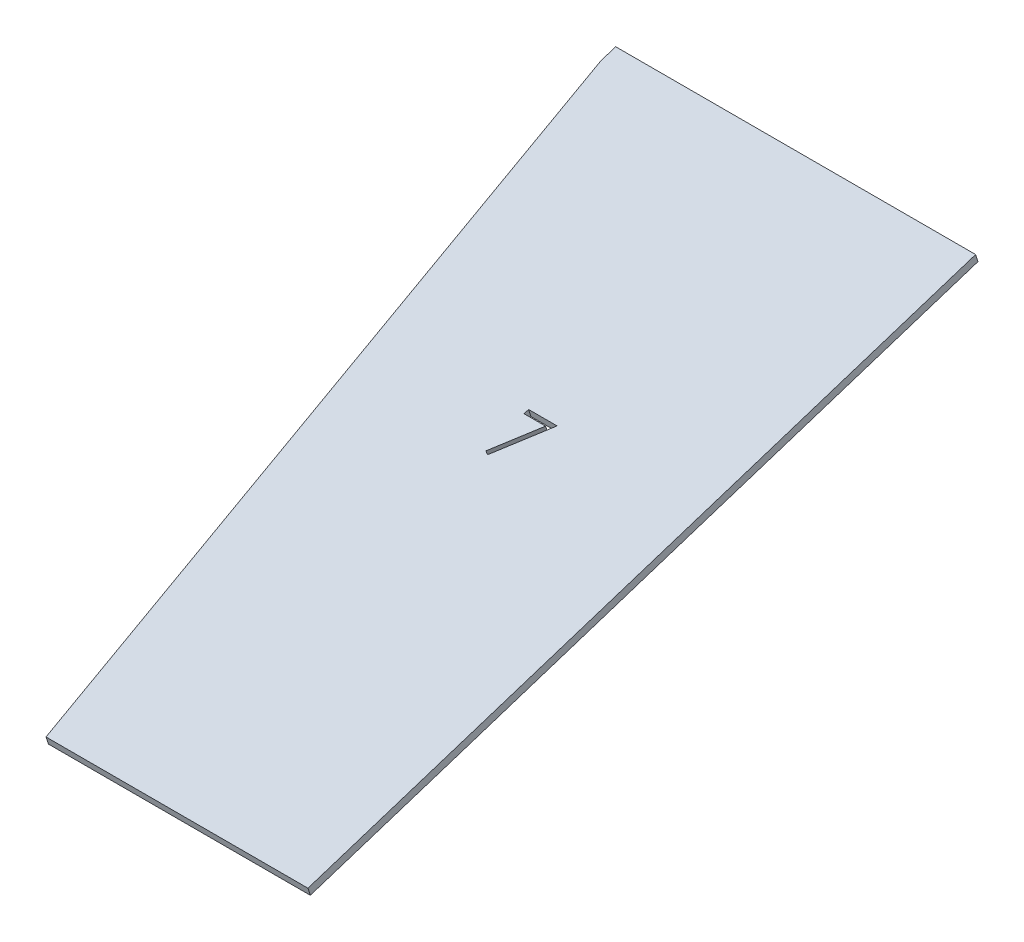
ISO-10303-21;
HEADER;
FILE_DESCRIPTION(('STEP AP214'),'2;1');
FILE_NAME('part.step','',(''),(''),'','','');
FILE_SCHEMA(('AUTOMOTIVE_DESIGN { 1 0 10303 214 1 1 1 1 }'));
ENDSEC;
DATA;
#1=APPLICATION_CONTEXT('core data for automotive mechanical design processes');
#2=APPLICATION_PROTOCOL_DEFINITION('international standard','automotive_design',2000,#1);
#3=PRODUCT_CONTEXT('',#1,'mechanical');
#4=PRODUCT('Part','Part','',(#3));
#5=PRODUCT_RELATED_PRODUCT_CATEGORY('part','',(#4));
#6=PRODUCT_DEFINITION_FORMATION('','',#4);
#7=PRODUCT_DEFINITION_CONTEXT('part definition',#1,'design');
#8=PRODUCT_DEFINITION('design','',#6,#7);
#9=PRODUCT_DEFINITION_SHAPE('','',#8);
#10=(LENGTH_UNIT() NAMED_UNIT(*) SI_UNIT(.MILLI.,.METRE.));
#11=(NAMED_UNIT(*) PLANE_ANGLE_UNIT() SI_UNIT($,.RADIAN.));
#12=(NAMED_UNIT(*) SI_UNIT($,.STERADIAN.) SOLID_ANGLE_UNIT());
#13=UNCERTAINTY_MEASURE_WITH_UNIT(LENGTH_MEASURE(1.E-05),#10,'distance_accuracy_value','');
#14=(GEOMETRIC_REPRESENTATION_CONTEXT(3) GLOBAL_UNCERTAINTY_ASSIGNED_CONTEXT((#13)) GLOBAL_UNIT_ASSIGNED_CONTEXT((#10,
#11,#12)) REPRESENTATION_CONTEXT('',''));
#15=CARTESIAN_POINT('',(0.,0.,0.));
#16=DIRECTION('',(0.,0.,1.));
#17=DIRECTION('',(1.,0.,0.));
#18=AXIS2_PLACEMENT_3D('',#15,#16,#17);
#19=CARTESIAN_POINT('',(-10.9533048052824,149.356785452526,-1974.9775057554));
#20=DIRECTION('',(-0.482179429384462,-0.268424662774435,0.833937166873444));
#21=DIRECTION('',(-0.876072484374709,0.147737605092896,-0.458988673240354));
#22=AXIS2_PLACEMENT_3D('',#19,#20,#21);
#23=PLANE('',#22);
#24=DIRECTION('',(0.,-0.951904302152191,-0.306395495306557));
#25=VECTOR('',#24,1.);
#26=CARTESIAN_POINT('',(-12.4301377379747,149.605833065012,-1975.75124263273));
#27=LINE('',#26,#25);
#28=CARTESIAN_POINT('',(-12.4301377379747,152.628129224346,-1974.77843693513));
#29=VERTEX_POINT('',#28);
#30=CARTESIAN_POINT('',(-12.4301377379747,149.605833065012,-1975.75124263273));
#31=VERTEX_POINT('',#30);
#32=EDGE_CURVE('E53',#29,#31,#27,.T.);
#33=ORIENTED_EDGE('',*,*,#32,.F.);
#34=DIRECTION('',(-0.876072484374709,0.147737605092896,-0.458988673240354));
#35=VECTOR('',#34,1.);
#36=CARTESIAN_POINT('',(-10.9533048052824,152.37908161186,-1974.0047000578));
#37=LINE('',#36,#35);
#38=CARTESIAN_POINT('',(-10.9533048052824,152.37908161186,-1974.0047000578));
#39=VERTEX_POINT('',#38);
#40=EDGE_CURVE('E124',#39,#29,#37,.T.);
#41=ORIENTED_EDGE('',*,*,#40,.F.);
#42=DIRECTION('',(0.,-0.951904302152191,-0.306395495306557));
#43=VECTOR('',#42,1.);
#44=CARTESIAN_POINT('',(-10.9533048052824,149.356785452526,-1974.9775057554));
#45=LINE('',#44,#43);
#46=CARTESIAN_POINT('',(-10.9533048052824,149.356785452526,-1974.9775057554));
#47=VERTEX_POINT('',#46);
#48=EDGE_CURVE('E159',#39,#47,#45,.T.);
#49=ORIENTED_EDGE('',*,*,#48,.T.);
#50=DIRECTION('',(-0.876072484374709,0.147737605092896,-0.458988673240354));
#51=VECTOR('',#50,1.);
#52=CARTESIAN_POINT('',(-10.9533048052824,149.356785452526,-1974.9775057554));
#53=LINE('',#52,#51);
#54=EDGE_CURVE('E171',#47,#31,#53,.T.);
#55=ORIENTED_EDGE('',*,*,#54,.T.);
#56=EDGE_LOOP('',(#33,#41,#49,#55));
#57=FACE_BOUND('',#56,.T.);
#58=ADVANCED_FACE('F45',(#57),#23,.F.);
#59=CARTESIAN_POINT('',(-0.939843266820893,155.343282053131,-1993.57625135129));
#60=DIRECTION('',(0.889933250556876,-0.139744163785751,0.434154786039603));
#61=DIRECTION('',(-0.456090790910398,-0.272671539094148,0.847131289833374));
#62=AXIS2_PLACEMENT_3D('',#59,#60,#61);
#63=PLANE('',#62);
#64=ORIENTED_EDGE('',*,*,#48,.F.);
#65=DIRECTION('',(-0.456090790910398,-0.272671539094148,0.847131289833374));
#66=VECTOR('',#65,1.);
#67=CARTESIAN_POINT('',(-0.939843266820893,158.365578212465,-1992.6034456537));
#68=LINE('',#67,#66);
#69=CARTESIAN_POINT('',(-0.939843266820894,158.365578212465,-1992.6034456537));
#70=VERTEX_POINT('',#69);
#71=EDGE_CURVE('E141',#70,#39,#68,.T.);
#72=ORIENTED_EDGE('',*,*,#71,.F.);
#73=DIRECTION('',(0.,-0.951904302152191,-0.306395495306557));
#74=VECTOR('',#73,1.);
#75=CARTESIAN_POINT('',(-0.939843266820893,155.343282053131,-1993.57625135129));
#76=LINE('',#75,#74);
#77=CARTESIAN_POINT('',(-0.939843266820893,155.343282053131,-1993.57625135129));
#78=VERTEX_POINT('',#77);
#79=EDGE_CURVE('E156',#70,#78,#76,.T.);
#80=ORIENTED_EDGE('',*,*,#79,.T.);
#81=DIRECTION('',(-0.456090790910398,-0.272671539094148,0.847131289833374));
#82=VECTOR('',#81,1.);
#83=CARTESIAN_POINT('',(-0.939843266820893,155.343282053131,-1993.57625135129));
#84=LINE('',#83,#82);
#85=EDGE_CURVE('E176',#78,#47,#84,.T.);
#86=ORIENTED_EDGE('',*,*,#85,.T.);
#87=EDGE_LOOP('',(#64,#72,#80,#86));
#88=FACE_BOUND('',#87,.T.);
#89=ADVANCED_FACE('F220',(#88),#63,.F.);
#90=CARTESIAN_POINT('',(-12.6629201898978,155.343282053131,-1993.57625135129));
#91=DIRECTION('',(0.,0.306395495306557,-0.951904302152191));
#92=DIRECTION('',(1.,0.,0.));
#93=AXIS2_PLACEMENT_3D('',#90,#91,#92);
#94=PLANE('',#93);
#95=ORIENTED_EDGE('',*,*,#79,.F.);
#96=DIRECTION('',(-1.,0.,0.));
#97=VECTOR('',#96,1.);
#98=CARTESIAN_POINT('',(-88.7498349655471,158.365578212465,-1992.6034456537));
#99=LINE('',#98,#97);
#100=CARTESIAN_POINT('',(-12.6629201898978,158.365578212465,-1992.6034456537));
#101=VERTEX_POINT('',#100);
#102=EDGE_CURVE('E138',#101,#70,#99,.F.);
#103=ORIENTED_EDGE('',*,*,#102,.F.);
#104=DIRECTION('',(0.,-0.951904302152191,-0.306395495306557));
#105=VECTOR('',#104,1.);
#106=CARTESIAN_POINT('',(-12.6629201898978,155.343282053131,-1993.57625135129));
#107=LINE('',#106,#105);
#108=CARTESIAN_POINT('',(-12.6629201898978,155.343282053131,-1993.57625135129));
#109=VERTEX_POINT('',#108);
#110=EDGE_CURVE('E154',#101,#109,#107,.T.);
#111=ORIENTED_EDGE('',*,*,#110,.T.);
#112=DIRECTION('',(1.,0.,0.));
#113=VECTOR('',#112,1.);
#114=CARTESIAN_POINT('',(-12.6629201898978,155.343282053131,-1993.57625135129));
#115=LINE('',#114,#113);
#116=EDGE_CURVE('E178',#109,#78,#115,.T.);
#117=ORIENTED_EDGE('',*,*,#116,.T.);
#118=EDGE_LOOP('',(#95,#103,#111,#117));
#119=FACE_BOUND('',#118,.T.);
#120=ADVANCED_FACE('F217',(#119),#94,.F.);
#121=CARTESIAN_POINT('',(-12.6629201898978,154.744632393071,-1991.7163767917));
#122=DIRECTION('',(-1.,0.,0.));
#123=DIRECTION('',(0.,0.306395495306554,-0.951904302152192));
#124=AXIS2_PLACEMENT_3D('',#121,#122,#123);
#125=PLANE('',#124);
#126=ORIENTED_EDGE('',*,*,#110,.F.);
#127=DIRECTION('',(0.,-0.306395495306557,0.951904302152191));
#128=VECTOR('',#127,1.);
#129=CARTESIAN_POINT('',(-12.6629201898978,-28.3626798878441,-1412.47927626528));
#130=LINE('',#129,#128);
#131=CARTESIAN_POINT('',(-12.6629201898978,157.766928552404,-1990.74357109411));
#132=VERTEX_POINT('',#131);
#133=EDGE_CURVE('E135',#132,#101,#130,.F.);
#134=ORIENTED_EDGE('',*,*,#133,.F.);
#135=DIRECTION('',(0.,-0.951904302152191,-0.306395495306557));
#136=VECTOR('',#135,1.);
#137=CARTESIAN_POINT('',(-12.6629201898978,154.744632393071,-1991.7163767917));
#138=LINE('',#137,#136);
#139=CARTESIAN_POINT('',(-12.6629201898978,154.744632393071,-1991.7163767917));
#140=VERTEX_POINT('',#139);
#141=EDGE_CURVE('E68',#132,#140,#138,.T.);
#142=ORIENTED_EDGE('',*,*,#141,.T.);
#143=DIRECTION('',(0.,0.306395495306554,-0.951904302152192));
#144=VECTOR('',#143,1.);
#145=CARTESIAN_POINT('',(-12.6629201898978,154.744632393071,-1991.7163767917));
#146=LINE('',#145,#144);
#147=EDGE_CURVE('E152',#140,#109,#146,.T.);
#148=ORIENTED_EDGE('',*,*,#147,.T.);
#149=EDGE_LOOP('',(#126,#134,#142,#148));
#150=FACE_BOUND('',#149,.T.);
#151=ADVANCED_FACE('F214',(#150),#125,.F.);
#152=CARTESIAN_POINT('',(-3.83245143989782,154.744632393071,-1991.7163767917));
#153=DIRECTION('',(0.,-0.306395495306557,0.951904302152191));
#154=DIRECTION('',(-1.,0.,0.));
#155=AXIS2_PLACEMENT_3D('',#152,#153,#154);
#156=PLANE('',#155);
#157=ORIENTED_EDGE('',*,*,#141,.F.);
#158=DIRECTION('',(-1.,0.,0.));
#159=VECTOR('',#158,1.);
#160=CARTESIAN_POINT('',(-88.7498349655471,157.766928552404,-1990.74357109411));
#161=LINE('',#160,#159);
#162=CARTESIAN_POINT('',(-3.83245143989781,157.766928552404,-1990.74357109411));
#163=VERTEX_POINT('',#162);
#164=EDGE_CURVE('E121',#163,#132,#161,.T.);
#165=ORIENTED_EDGE('',*,*,#164,.F.);
#166=DIRECTION('',(0.,-0.951904302152191,-0.306395495306557));
#167=VECTOR('',#166,1.);
#168=CARTESIAN_POINT('',(-3.83245143989782,154.744632393071,-1991.7163767917));
#169=LINE('',#168,#167);
#170=CARTESIAN_POINT('',(-3.83245143989782,154.744632393071,-1991.7163767917));
#171=VERTEX_POINT('',#170);
#172=EDGE_CURVE('E105',#163,#171,#169,.T.);
#173=ORIENTED_EDGE('',*,*,#172,.T.);
#174=DIRECTION('',(-1.,0.,0.));
#175=VECTOR('',#174,1.);
#176=CARTESIAN_POINT('',(-3.83245143989782,154.744632393071,-1991.7163767917));
#177=LINE('',#176,#175);
#178=EDGE_CURVE('E174',#171,#140,#177,.T.);
#179=ORIENTED_EDGE('',*,*,#178,.T.);
#180=EDGE_LOOP('',(#157,#165,#173,#179));
#181=FACE_BOUND('',#180,.T.);
#182=ADVANCED_FACE('F126',(#181),#156,.F.);
#183=CARTESIAN_POINT('',(-88.7498349655472,191.216,-2105.025));
#184=DIRECTION('',(0.,0.306395495306557,-0.951904302152191));
#185=DIRECTION('',(1.,0.,0.));
#186=AXIS2_PLACEMENT_3D('',#183,#184,#185);
#187=PLANE('',#186);
#188=DIRECTION('',(0.,-0.951904302152191,-0.306395495306557));
#189=VECTOR('',#188,1.);
#190=CARTESIAN_POINT('',(-88.2498349655882,191.216,-2105.025));
#191=LINE('',#190,#189);
#192=CARTESIAN_POINT('',(-88.2498349655882,194.238296159333,-2104.0521943024));
#193=VERTEX_POINT('',#192);
#194=CARTESIAN_POINT('',(-88.2498349655882,191.216,-2105.025));
#195=VERTEX_POINT('',#194);
#196=EDGE_CURVE('E191',#193,#195,#191,.T.);
#197=ORIENTED_EDGE('',*,*,#196,.F.);
#198=DIRECTION('',(-1.,0.,0.));
#199=VECTOR('',#198,1.);
#200=CARTESIAN_POINT('',(-88.7498349655471,194.238296159333,-2104.0521943024));
#201=LINE('',#200,#199);
#202=CARTESIAN_POINT('',(59.9999999999999,194.238296159333,-2104.0521943024));
#203=VERTEX_POINT('',#202);
#204=EDGE_CURVE('E186',#193,#203,#201,.F.);
#205=ORIENTED_EDGE('',*,*,#204,.T.);
#206=DIRECTION('',(0.,-0.951904302152191,-0.306395495306557));
#207=VECTOR('',#206,1.);
#208=CARTESIAN_POINT('',(60.,191.216,-2105.025));
#209=LINE('',#208,#207);
#210=CARTESIAN_POINT('',(60.,191.216,-2105.025));
#211=VERTEX_POINT('',#210);
#212=EDGE_CURVE('E115',#203,#211,#209,.T.);
#213=ORIENTED_EDGE('',*,*,#212,.T.);
#214=DIRECTION('',(1.,0.,0.));
#215=VECTOR('',#214,1.);
#216=CARTESIAN_POINT('',(-88.7498349655472,191.216,-2105.025));
#217=LINE('',#216,#215);
#218=EDGE_CURVE('E208',#195,#211,#217,.T.);
#219=ORIENTED_EDGE('',*,*,#218,.F.);
#220=EDGE_LOOP('',(#197,#205,#213,#219));
#221=FACE_BOUND('',#220,.T.);
#222=ADVANCED_FACE('F235',(#221),#187,.T.);
#223=CARTESIAN_POINT('',(60.,-31.3849760471773,-1413.45208196288));
#224=DIRECTION('',(1.,0.,0.));
#225=DIRECTION('',(0.,-0.306395495306558,0.951904302152191));
#226=AXIS2_PLACEMENT_3D('',#223,#224,#225);
#227=PLANE('',#226);
#228=ORIENTED_EDGE('',*,*,#212,.F.);
#229=DIRECTION('',(0.,-0.306395495306557,0.951904302152191));
#230=VECTOR('',#229,1.);
#231=CARTESIAN_POINT('',(59.9999999999999,-28.3626798878441,-1412.47927626528));
#232=LINE('',#231,#230);
#233=CARTESIAN_POINT('',(60.,105.722296159333,-1829.0521943024));
#234=VERTEX_POINT('',#233);
#235=EDGE_CURVE('E129',#203,#234,#232,.T.);
#236=ORIENTED_EDGE('',*,*,#235,.T.);
#237=DIRECTION('',(0.,-0.951904302152191,-0.306395495306557));
#238=VECTOR('',#237,1.);
#239=CARTESIAN_POINT('',(60.,102.7,-1830.025));
#240=LINE('',#239,#238);
#241=CARTESIAN_POINT('',(60.,102.7,-1830.025));
#242=VERTEX_POINT('',#241);
#243=EDGE_CURVE('E144',#234,#242,#240,.T.);
#244=ORIENTED_EDGE('',*,*,#243,.T.);
#245=DIRECTION('',(0.,-0.306395495306558,0.951904302152191));
#246=VECTOR('',#245,1.);
#247=CARTESIAN_POINT('',(60.,-31.3849760471773,-1413.45208196288));
#248=LINE('',#247,#246);
#249=EDGE_CURVE('E211',#211,#242,#248,.T.);
#250=ORIENTED_EDGE('',*,*,#249,.F.);
#251=EDGE_LOOP('',(#228,#236,#244,#250));
#252=FACE_BOUND('',#251,.T.);
#253=ADVANCED_FACE('F239',(#252),#227,.T.);
#254=CARTESIAN_POINT('',(100.,102.7,-1830.025));
#255=DIRECTION('',(0.,-0.306395495306557,0.951904302152191));
#256=DIRECTION('',(-1.,0.,0.));
#257=AXIS2_PLACEMENT_3D('',#254,#255,#256);
#258=PLANE('',#257);
#259=DIRECTION('',(-1.,0.,0.));
#260=VECTOR('',#259,1.);
#261=CARTESIAN_POINT('',(100.,102.7,-1830.025));
#262=LINE('',#261,#260);
#263=CARTESIAN_POINT('',(-47.8897964925185,102.7,-1830.025));
#264=VERTEX_POINT('',#263);
#265=EDGE_CURVE('E137',#242,#264,#262,.T.);
#266=ORIENTED_EDGE('',*,*,#265,.F.);
#267=ORIENTED_EDGE('',*,*,#243,.F.);
#268=DIRECTION('',(-1.,0.,0.));
#269=VECTOR('',#268,1.);
#270=CARTESIAN_POINT('',(-88.7498349655471,105.722296159333,-1829.0521943024));
#271=LINE('',#270,#269);
#272=CARTESIAN_POINT('',(-47.8897964925185,105.722296159333,-1829.0521943024));
#273=VERTEX_POINT('',#272);
#274=EDGE_CURVE('E127',#273,#234,#271,.F.);
#275=ORIENTED_EDGE('',*,*,#274,.F.);
#276=DIRECTION('',(0.,-0.951904302152191,-0.306395495306557));
#277=VECTOR('',#276,1.);
#278=CARTESIAN_POINT('',(-47.8897964925185,102.7,-1830.025));
#279=LINE('',#278,#277);
#280=EDGE_CURVE('E147',#273,#264,#279,.T.);
#281=ORIENTED_EDGE('',*,*,#280,.T.);
#282=EDGE_LOOP('',(#266,#267,#275,#281));
#283=FACE_BOUND('',#282,.T.);
#284=ADVANCED_FACE('F247',(#283),#258,.T.);
#285=CARTESIAN_POINT('',(-79.1785078624466,169.798858066637,-2038.48658850745));
#286=DIRECTION('',(0.989947078814199,0.0433360454630693,-0.134635687359845));
#287=DIRECTION('',(0.141438259135338,-0.303315325540556,0.942334883226229));
#288=AXIS2_PLACEMENT_3D('',#285,#286,#287);
#289=PLANE('',#288);
#290=DIRECTION('',(0.,-0.951904302152191,-0.306395495306558));
#291=VECTOR('',#290,1.);
#292=CARTESIAN_POINT('',(-88.2498349655882,189.25238181753,-2098.92446450157));
#293=LINE('',#292,#291);
#294=CARTESIAN_POINT('',(-88.2498349655882,189.252381817532,-2098.92446450157));
#295=VERTEX_POINT('',#294);
#296=CARTESIAN_POINT('',(-88.2498349655887,192.274677976865,-2097.95165880398));
#297=VERTEX_POINT('',#296);
#298=EDGE_CURVE('E60',#295,#297,#293,.F.);
#299=ORIENTED_EDGE('',*,*,#298,.F.);
#300=DIRECTION('',(0.141438259135338,-0.303315325540556,0.942334883226229));
#301=VECTOR('',#300,1.);
#302=CARTESIAN_POINT('',(-79.1785078624466,169.798858066637,-2038.48658850745));
#303=LINE('',#302,#301);
#304=EDGE_CURVE('E205',#295,#264,#303,.T.);
#305=ORIENTED_EDGE('',*,*,#304,.T.);
#306=ORIENTED_EDGE('',*,*,#280,.F.);
#307=DIRECTION('',(0.141438259135338,-0.303315325540556,0.942334883226229));
#308=VECTOR('',#307,1.);
#309=CARTESIAN_POINT('',(-79.1785078624466,172.82115422597,-2037.51378280985));
#310=LINE('',#309,#308);
#311=EDGE_CURVE('E133',#297,#273,#310,.T.);
#312=ORIENTED_EDGE('',*,*,#311,.F.);
#313=EDGE_LOOP('',(#299,#305,#306,#312));
#314=FACE_BOUND('',#313,.T.);
#315=ADVANCED_FACE('F244',(#314),#289,.F.);
#316=CARTESIAN_POINT('',(-12.4301377379747,149.605833065012,-1975.75124263273));
#317=DIRECTION('',(-0.889887017756644,0.139771800377398,-0.434240646931454));
#318=DIRECTION('',(0.456180989989924,0.272657373572421,-0.847087280631933));
#319=AXIS2_PLACEMENT_3D('',#316,#317,#318);
#320=PLANE('',#319);
#321=DIRECTION('',(0.456180989989924,0.272657373572421,-0.847087280631933));
#322=VECTOR('',#321,1.);
#323=CARTESIAN_POINT('',(-12.4301377379747,152.628129224346,-1974.77843693513));
#324=LINE('',#323,#322);
#325=EDGE_CURVE('E108',#29,#163,#324,.T.);
#326=ORIENTED_EDGE('',*,*,#325,.F.);
#327=ORIENTED_EDGE('',*,*,#32,.T.);
#328=DIRECTION('',(0.456180989989924,0.272657373572421,-0.847087280631933));
#329=VECTOR('',#328,1.);
#330=CARTESIAN_POINT('',(-12.4301377379747,149.605833065012,-1975.75124263273));
#331=LINE('',#330,#329);
#332=EDGE_CURVE('E111',#31,#171,#331,.T.);
#333=ORIENTED_EDGE('',*,*,#332,.T.);
#334=ORIENTED_EDGE('',*,*,#172,.F.);
#335=EDGE_LOOP('',(#326,#327,#333,#334));
#336=FACE_BOUND('',#335,.T.);
#337=ADVANCED_FACE('F47',(#336),#320,.F.);
#338=CARTESIAN_POINT('',(-88.7498349655471,-31.3849760471773,-1413.45208196288));
#339=DIRECTION('',(0.,-0.951904302152191,-0.306395495306557));
#340=DIRECTION('',(0.,-0.306395495306557,0.951904302152191));
#341=AXIS2_PLACEMENT_3D('',#338,#339,#340);
#342=PLANE('',#341);
#343=DIRECTION('',(0.,-0.306395495306456,0.951904302152223));
#344=VECTOR('',#343,1.);
#345=CARTESIAN_POINT('',(-88.2498349655882,186.697119757619,-2090.98581988957));
#346=LINE('',#345,#344);
#347=EDGE_CURVE('E199',#195,#295,#346,.T.);
#348=ORIENTED_EDGE('',*,*,#347,.F.);
#349=ORIENTED_EDGE('',*,*,#218,.T.);
#350=ORIENTED_EDGE('',*,*,#249,.T.);
#351=ORIENTED_EDGE('',*,*,#265,.T.);
#352=ORIENTED_EDGE('',*,*,#304,.F.);
#353=EDGE_LOOP('',(#348,#349,#350,#351,#352));
#354=FACE_BOUND('',#353,.T.);
#355=ORIENTED_EDGE('',*,*,#178,.F.);
#356=ORIENTED_EDGE('',*,*,#332,.F.);
#357=ORIENTED_EDGE('',*,*,#54,.F.);
#358=ORIENTED_EDGE('',*,*,#85,.F.);
#359=ORIENTED_EDGE('',*,*,#116,.F.);
#360=ORIENTED_EDGE('',*,*,#147,.F.);
#361=EDGE_LOOP('',(#355,#356,#357,#358,#359,#360));
#362=FACE_BOUND('',#361,.T.);
#363=ADVANCED_FACE('F169',(#354,#362),#342,.T.);
#364=CARTESIAN_POINT('',(-88.7498349655471,-28.3626798878441,-1412.47927626528));
#365=DIRECTION('',(0.,-0.951904302152191,-0.306395495306557));
#366=DIRECTION('',(0.,-0.306395495306557,0.951904302152191));
#367=AXIS2_PLACEMENT_3D('',#364,#365,#366);
#368=PLANE('',#367);
#369=ORIENTED_EDGE('',*,*,#204,.F.);
#370=DIRECTION('',(0.,-0.306395495306557,0.951904302152191));
#371=VECTOR('',#370,1.);
#372=CARTESIAN_POINT('',(-88.2498349655882,-28.3626798878441,-1412.47927626528));
#373=LINE('',#372,#371);
#374=EDGE_CURVE('E11',#193,#297,#373,.T.);
#375=ORIENTED_EDGE('',*,*,#374,.T.);
#376=ORIENTED_EDGE('',*,*,#311,.T.);
#377=ORIENTED_EDGE('',*,*,#274,.T.);
#378=ORIENTED_EDGE('',*,*,#235,.F.);
#379=EDGE_LOOP('',(#369,#375,#376,#377,#378));
#380=FACE_BOUND('',#379,.T.);
#381=ORIENTED_EDGE('',*,*,#164,.T.);
#382=ORIENTED_EDGE('',*,*,#133,.T.);
#383=ORIENTED_EDGE('',*,*,#102,.T.);
#384=ORIENTED_EDGE('',*,*,#71,.T.);
#385=ORIENTED_EDGE('',*,*,#40,.T.);
#386=ORIENTED_EDGE('',*,*,#325,.T.);
#387=EDGE_LOOP('',(#381,#382,#383,#384,#385,#386));
#388=FACE_BOUND('',#387,.T.);
#389=ADVANCED_FACE('F119',(#380,#388),#368,.F.);
#390=CARTESIAN_POINT('',(-88.2498349655882,0.,0.));
#391=DIRECTION('',(1.,0.,0.));
#392=DIRECTION('',(0.,0.,-1.));
#393=AXIS2_PLACEMENT_3D('',#390,#391,#392);
#394=PLANE('',#393);
#395=ORIENTED_EDGE('',*,*,#196,.T.);
#396=ORIENTED_EDGE('',*,*,#347,.T.);
#397=ORIENTED_EDGE('',*,*,#298,.T.);
#398=ORIENTED_EDGE('',*,*,#374,.F.);
#399=EDGE_LOOP('',(#395,#396,#397,#398));
#400=FACE_BOUND('',#399,.T.);
#401=ADVANCED_FACE('F233',(#400),#394,.F.);
#402=CLOSED_SHELL('',(#58,#89,#120,#151,#182,#222,#253,#284,#315,#337,#363,#389,#401));
#403=MANIFOLD_SOLID_BREP('B2',#402);
#404=ADVANCED_BREP_SHAPE_REPRESENTATION('',(#18,#403),#14);
#405=SHAPE_DEFINITION_REPRESENTATION(#9,#404);
ENDSEC;
END-ISO-10303-21;
